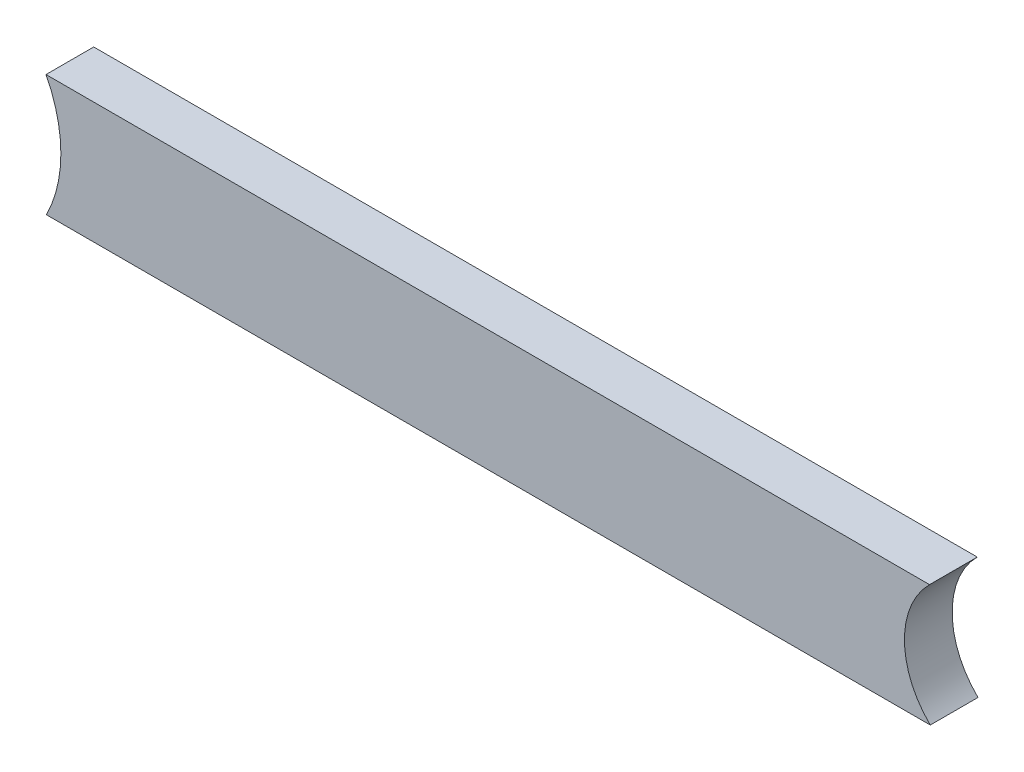
ISO-10303-21;
HEADER;
FILE_DESCRIPTION(('STEP AP214'),'2;1');
FILE_NAME('part.step','',(''),(''),'','','');
FILE_SCHEMA(('AUTOMOTIVE_DESIGN { 1 0 10303 214 1 1 1 1 }'));
ENDSEC;
DATA;
#1=APPLICATION_CONTEXT('core data for automotive mechanical design processes');
#2=APPLICATION_PROTOCOL_DEFINITION('international standard','automotive_design',2000,#1);
#3=PRODUCT_CONTEXT('',#1,'mechanical');
#4=PRODUCT('Part','Part','',(#3));
#5=PRODUCT_RELATED_PRODUCT_CATEGORY('part','',(#4));
#6=PRODUCT_DEFINITION_FORMATION('','',#4);
#7=PRODUCT_DEFINITION_CONTEXT('part definition',#1,'design');
#8=PRODUCT_DEFINITION('design','',#6,#7);
#9=PRODUCT_DEFINITION_SHAPE('','',#8);
#10=(LENGTH_UNIT() NAMED_UNIT(*) SI_UNIT(.MILLI.,.METRE.));
#11=(NAMED_UNIT(*) PLANE_ANGLE_UNIT() SI_UNIT($,.RADIAN.));
#12=(NAMED_UNIT(*) SI_UNIT($,.STERADIAN.) SOLID_ANGLE_UNIT());
#13=UNCERTAINTY_MEASURE_WITH_UNIT(LENGTH_MEASURE(1.E-05),#10,'distance_accuracy_value','');
#14=(GEOMETRIC_REPRESENTATION_CONTEXT(3) GLOBAL_UNCERTAINTY_ASSIGNED_CONTEXT((#13)) GLOBAL_UNIT_ASSIGNED_CONTEXT((#10,
#11,#12)) REPRESENTATION_CONTEXT('',''));
#15=CARTESIAN_POINT('',(0.,0.,0.));
#16=DIRECTION('',(0.,0.,1.));
#17=DIRECTION('',(1.,0.,0.));
#18=AXIS2_PLACEMENT_3D('',#15,#16,#17);
#19=CARTESIAN_POINT('',(134.225234985202,90.6765014,0.));
#20=DIRECTION('',(0.,1.,0.));
#21=DIRECTION('',(1.,0.,0.));
#22=AXIS2_PLACEMENT_3D('',#19,#20,#21);
#23=PLANE('',#22);
#24=DIRECTION('',(1.,0.,0.));
#25=VECTOR('',#24,1.);
#26=CARTESIAN_POINT('',(133.7324986,90.6765014,0.1999996));
#27=LINE('',#26,#25);
#28=CARTESIAN_POINT('',(134.225234985202,90.6765014,0.1999996));
#29=VERTEX_POINT('',#28);
#30=CARTESIAN_POINT('',(137.928670613557,90.6765014,0.1999996));
#31=VERTEX_POINT('',#30);
#32=EDGE_CURVE('E11',#29,#31,#27,.T.);
#33=ORIENTED_EDGE('',*,*,#32,.F.);
#34=DIRECTION('',(0.,0.,1.));
#35=VECTOR('',#34,1.);
#36=CARTESIAN_POINT('',(134.225234985202,90.6765014,0.));
#37=LINE('',#36,#35);
#38=CARTESIAN_POINT('',(134.225234985202,90.6765014,0.));
#39=VERTEX_POINT('',#38);
#40=EDGE_CURVE('E24',#39,#29,#37,.T.);
#41=ORIENTED_EDGE('',*,*,#40,.F.);
#42=DIRECTION('',(1.,0.,0.));
#43=VECTOR('',#42,1.);
#44=CARTESIAN_POINT('',(133.7324986,90.6765014,0.));
#45=LINE('',#44,#43);
#46=CARTESIAN_POINT('',(137.928670613557,90.6765014,0.));
#47=VERTEX_POINT('',#46);
#48=EDGE_CURVE('E82',#39,#47,#45,.T.);
#49=ORIENTED_EDGE('',*,*,#48,.T.);
#50=DIRECTION('',(0.,0.,1.));
#51=VECTOR('',#50,1.);
#52=CARTESIAN_POINT('',(137.928670613557,90.6765014,0.));
#53=LINE('',#52,#51);
#54=EDGE_CURVE('E37',#47,#31,#53,.T.);
#55=ORIENTED_EDGE('',*,*,#54,.T.);
#56=EDGE_LOOP('',(#33,#41,#49,#55));
#57=FACE_BOUND('',#56,.T.);
#58=ADVANCED_FACE('F17',(#57),#23,.F.);
#59=CARTESIAN_POINT('',(138.176,90.932,0.));
#60=DIRECTION('',(0.,0.,-1.));
#61=DIRECTION('',(1.,0.,0.));
#62=AXIS2_PLACEMENT_3D('',#59,#60,#61);
#63=CYLINDRICAL_SURFACE('',#62,0.3556);
#64=DIRECTION('',(0.,0.,1.));
#65=VECTOR('',#64,1.);
#66=CARTESIAN_POINT('',(137.925611495875,91.1845014,0.));
#67=LINE('',#66,#65);
#68=CARTESIAN_POINT('',(137.925611495875,91.1845014,0.));
#69=VERTEX_POINT('',#68);
#70=CARTESIAN_POINT('',(137.925611495875,91.1845014,0.1999996));
#71=VERTEX_POINT('',#70);
#72=EDGE_CURVE('E97',#69,#71,#67,.T.);
#73=ORIENTED_EDGE('',*,*,#72,.T.);
#74=CARTESIAN_POINT('',(138.176,90.932,0.1999996));
#75=DIRECTION('',(0.,0.,1.));
#76=DIRECTION('',(1.,0.,0.));
#77=AXIS2_PLACEMENT_3D('',#74,#75,#76);
#78=CIRCLE('',#77,0.3556);
#79=EDGE_CURVE('E94',#71,#31,#78,.T.);
#80=ORIENTED_EDGE('',*,*,#79,.T.);
#81=ORIENTED_EDGE('',*,*,#54,.F.);
#82=CARTESIAN_POINT('',(138.176,90.932,0.));
#83=DIRECTION('',(0.,0.,1.));
#84=DIRECTION('',(1.,0.,0.));
#85=AXIS2_PLACEMENT_3D('',#82,#83,#84);
#86=CIRCLE('',#85,0.3556);
#87=EDGE_CURVE('E92',#69,#47,#86,.T.);
#88=ORIENTED_EDGE('',*,*,#87,.F.);
#89=EDGE_LOOP('',(#73,#80,#81,#88));
#90=FACE_BOUND('',#89,.T.);
#91=ADVANCED_FACE('F102',(#90),#63,.F.);
#92=CARTESIAN_POINT('',(137.925611495875,91.1845014,0.));
#93=DIRECTION('',(0.,-1.,0.));
#94=DIRECTION('',(-1.,0.,0.));
#95=AXIS2_PLACEMENT_3D('',#92,#93,#94);
#96=PLANE('',#95);
#97=DIRECTION('',(-1.,0.,0.));
#98=VECTOR('',#97,1.);
#99=CARTESIAN_POINT('',(138.1745014,91.1845014,0.1999996));
#100=LINE('',#99,#98);
#101=CARTESIAN_POINT('',(134.223692239636,91.1845014,0.1999996));
#102=VERTEX_POINT('',#101);
#103=EDGE_CURVE('E89',#71,#102,#100,.T.);
#104=ORIENTED_EDGE('',*,*,#103,.F.);
#105=ORIENTED_EDGE('',*,*,#72,.F.);
#106=DIRECTION('',(-1.,0.,0.));
#107=VECTOR('',#106,1.);
#108=CARTESIAN_POINT('',(138.1745014,91.1845014,0.));
#109=LINE('',#108,#107);
#110=CARTESIAN_POINT('',(134.223692239636,91.1845014,0.));
#111=VERTEX_POINT('',#110);
#112=EDGE_CURVE('E87',#69,#111,#109,.T.);
#113=ORIENTED_EDGE('',*,*,#112,.T.);
#114=DIRECTION('',(0.,0.,1.));
#115=VECTOR('',#114,1.);
#116=CARTESIAN_POINT('',(134.223692239636,91.1845014,0.));
#117=LINE('',#116,#115);
#118=EDGE_CURVE('E69',#111,#102,#117,.T.);
#119=ORIENTED_EDGE('',*,*,#118,.T.);
#120=EDGE_LOOP('',(#104,#105,#113,#119));
#121=FACE_BOUND('',#120,.T.);
#122=ADVANCED_FACE('F108',(#121),#96,.F.);
#123=CARTESIAN_POINT('',(133.731,90.9290028,0.));
#124=DIRECTION('',(0.,0.,-1.));
#125=DIRECTION('',(1.,0.,0.));
#126=AXIS2_PLACEMENT_3D('',#123,#124,#125);
#127=CYLINDRICAL_SURFACE('',#126,0.55500016);
#128=DIRECTION('',(0.,0.,1.));
#129=VECTOR('',#128,1.);
#130=CARTESIAN_POINT('',(134.28600016,90.9290028,0.));
#131=LINE('',#130,#129);
#132=CARTESIAN_POINT('',(134.28600016,90.9290028,0.));
#133=VERTEX_POINT('',#132);
#134=CARTESIAN_POINT('',(134.28600016,90.9290028,0.1999996));
#135=VERTEX_POINT('',#134);
#136=EDGE_CURVE('E59',#133,#135,#131,.T.);
#137=ORIENTED_EDGE('',*,*,#136,.T.);
#138=CARTESIAN_POINT('',(133.731,90.9290028,0.1999996));
#139=DIRECTION('',(0.,0.,1.));
#140=DIRECTION('',(1.,0.,0.));
#141=AXIS2_PLACEMENT_3D('',#138,#139,#140);
#142=CIRCLE('',#141,0.55500016);
#143=EDGE_CURVE('E70',#135,#102,#142,.T.);
#144=ORIENTED_EDGE('',*,*,#143,.T.);
#145=ORIENTED_EDGE('',*,*,#118,.F.);
#146=CARTESIAN_POINT('',(133.731,90.9290028,0.));
#147=DIRECTION('',(0.,0.,1.));
#148=DIRECTION('',(1.,0.,0.));
#149=AXIS2_PLACEMENT_3D('',#146,#147,#148);
#150=CIRCLE('',#149,0.55500016);
#151=EDGE_CURVE('E73',#133,#111,#150,.T.);
#152=ORIENTED_EDGE('',*,*,#151,.F.);
#153=EDGE_LOOP('',(#137,#144,#145,#152));
#154=FACE_BOUND('',#153,.T.);
#155=ADVANCED_FACE('F74',(#154),#127,.F.);
#156=CARTESIAN_POINT('',(133.731,90.9290028,0.));
#157=DIRECTION('',(0.,0.,-1.));
#158=DIRECTION('',(1.,0.,0.));
#159=AXIS2_PLACEMENT_3D('',#156,#157,#158);
#160=CYLINDRICAL_SURFACE('',#159,0.55500016);
#161=ORIENTED_EDGE('',*,*,#40,.T.);
#162=CARTESIAN_POINT('',(133.731,90.9290028,0.1999996));
#163=DIRECTION('',(0.,0.,1.));
#164=DIRECTION('',(1.,0.,0.));
#165=AXIS2_PLACEMENT_3D('',#162,#163,#164);
#166=CIRCLE('',#165,0.55500016);
#167=EDGE_CURVE('E65',#29,#135,#166,.T.);
#168=ORIENTED_EDGE('',*,*,#167,.T.);
#169=ORIENTED_EDGE('',*,*,#136,.F.);
#170=EDGE_CURVE('E63',#39,#133,#150,.T.);
#171=ORIENTED_EDGE('',*,*,#170,.F.);
#172=EDGE_LOOP('',(#161,#168,#169,#171));
#173=FACE_BOUND('',#172,.T.);
#174=ADVANCED_FACE('F61',(#173),#160,.F.);
#175=CARTESIAN_POINT('',(133.7324986,90.6765014,0.));
#176=DIRECTION('',(0.,0.,-1.));
#177=DIRECTION('',(-1.,0.,0.));
#178=AXIS2_PLACEMENT_3D('',#175,#176,#177);
#179=PLANE('',#178);
#180=ORIENTED_EDGE('',*,*,#48,.F.);
#181=ORIENTED_EDGE('',*,*,#170,.T.);
#182=ORIENTED_EDGE('',*,*,#151,.T.);
#183=ORIENTED_EDGE('',*,*,#112,.F.);
#184=ORIENTED_EDGE('',*,*,#87,.T.);
#185=EDGE_LOOP('',(#180,#181,#182,#183,#184));
#186=FACE_BOUND('',#185,.T.);
#187=ADVANCED_FACE('F80',(#186),#179,.T.);
#188=CARTESIAN_POINT('',(133.7324986,90.6765014,0.1999996));
#189=DIRECTION('',(0.,0.,-1.));
#190=DIRECTION('',(-1.,0.,0.));
#191=AXIS2_PLACEMENT_3D('',#188,#189,#190);
#192=PLANE('',#191);
#193=ORIENTED_EDGE('',*,*,#167,.F.);
#194=ORIENTED_EDGE('',*,*,#32,.T.);
#195=ORIENTED_EDGE('',*,*,#79,.F.);
#196=ORIENTED_EDGE('',*,*,#103,.T.);
#197=ORIENTED_EDGE('',*,*,#143,.F.);
#198=EDGE_LOOP('',(#193,#194,#195,#196,#197));
#199=FACE_BOUND('',#198,.T.);
#200=ADVANCED_FACE('F106',(#199),#192,.F.);
#201=CLOSED_SHELL('',(#58,#91,#122,#155,#174,#187,#200));
#202=MANIFOLD_SOLID_BREP('B1',#201);
#203=ADVANCED_BREP_SHAPE_REPRESENTATION('',(#18,#202),#14);
#204=SHAPE_DEFINITION_REPRESENTATION(#9,#203);
ENDSEC;
END-ISO-10303-21;
